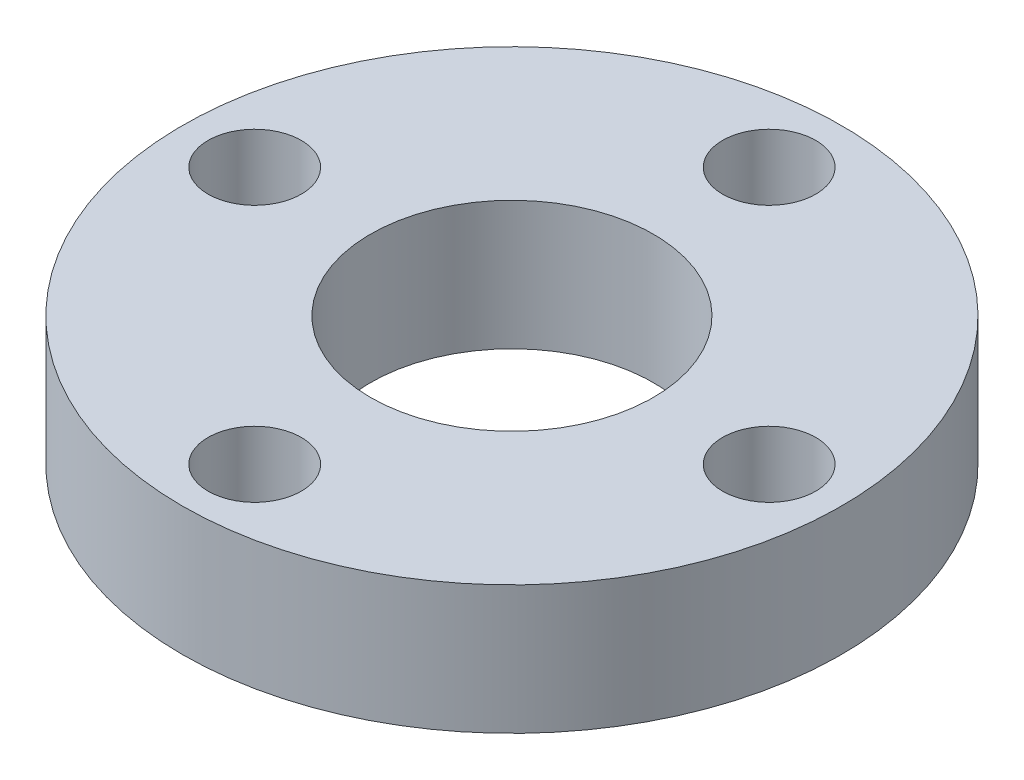
ISO-10303-21;
HEADER;
FILE_DESCRIPTION(('STEP AP214'),'2;1');
FILE_NAME('part.step','',(''),(''),'','','');
FILE_SCHEMA(('AUTOMOTIVE_DESIGN { 1 0 10303 214 1 1 1 1 }'));
ENDSEC;
DATA;
#1=APPLICATION_CONTEXT('core data for automotive mechanical design processes');
#2=APPLICATION_PROTOCOL_DEFINITION('international standard','automotive_design',2000,#1);
#3=PRODUCT_CONTEXT('',#1,'mechanical');
#4=PRODUCT('Part','Part','',(#3));
#5=PRODUCT_RELATED_PRODUCT_CATEGORY('part','',(#4));
#6=PRODUCT_DEFINITION_FORMATION('','',#4);
#7=PRODUCT_DEFINITION_CONTEXT('part definition',#1,'design');
#8=PRODUCT_DEFINITION('design','',#6,#7);
#9=PRODUCT_DEFINITION_SHAPE('','',#8);
#10=(LENGTH_UNIT() NAMED_UNIT(*) SI_UNIT(.MILLI.,.METRE.));
#11=(NAMED_UNIT(*) PLANE_ANGLE_UNIT() SI_UNIT($,.RADIAN.));
#12=(NAMED_UNIT(*) SI_UNIT($,.STERADIAN.) SOLID_ANGLE_UNIT());
#13=UNCERTAINTY_MEASURE_WITH_UNIT(LENGTH_MEASURE(1.E-05),#10,'distance_accuracy_value','');
#14=(GEOMETRIC_REPRESENTATION_CONTEXT(3) GLOBAL_UNCERTAINTY_ASSIGNED_CONTEXT((#13)) GLOBAL_UNIT_ASSIGNED_CONTEXT((#10,
#11,#12)) REPRESENTATION_CONTEXT('',''));
#15=CARTESIAN_POINT('',(0.,0.,0.));
#16=DIRECTION('',(0.,0.,1.));
#17=DIRECTION('',(1.,0.,0.));
#18=AXIS2_PLACEMENT_3D('',#15,#16,#17);
#19=CARTESIAN_POINT('',(0.,4.,0.));
#20=DIRECTION('',(0.,-1.,0.));
#21=DIRECTION('',(0.,0.,-1.));
#22=AXIS2_PLACEMENT_3D('',#19,#20,#21);
#23=CYLINDRICAL_SURFACE('',#22,10.25);
#24=CARTESIAN_POINT('',(0.,4.,0.));
#25=DIRECTION('',(0.,1.,0.));
#26=DIRECTION('',(0.,0.,1.));
#27=AXIS2_PLACEMENT_3D('',#24,#25,#26);
#28=CIRCLE('',#27,10.25);
#29=CARTESIAN_POINT('',(0.,4.,10.25));
#30=VERTEX_POINT('',#29);
#31=EDGE_CURVE('E54',#30,#30,#28,.T.);
#32=ORIENTED_EDGE('',*,*,#31,.F.);
#33=EDGE_LOOP('',(#32));
#34=FACE_BOUND('',#33,.T.);
#35=CARTESIAN_POINT('',(0.,0.,0.));
#36=DIRECTION('',(0.,1.,0.));
#37=DIRECTION('',(0.,0.,1.));
#38=AXIS2_PLACEMENT_3D('',#35,#36,#37);
#39=CIRCLE('',#38,10.25);
#40=CARTESIAN_POINT('',(0.,0.,10.25));
#41=VERTEX_POINT('',#40);
#42=EDGE_CURVE('E79',#41,#41,#39,.T.);
#43=ORIENTED_EDGE('',*,*,#42,.T.);
#44=EDGE_LOOP('',(#43));
#45=FACE_BOUND('',#44,.T.);
#46=ADVANCED_FACE('F45',(#34,#45),#23,.T.);
#47=CARTESIAN_POINT('',(0.,4.,8.));
#48=DIRECTION('',(0.,-1.,0.));
#49=DIRECTION('',(0.,0.,-1.));
#50=AXIS2_PLACEMENT_3D('',#47,#48,#49);
#51=CYLINDRICAL_SURFACE('',#50,1.45);
#52=CARTESIAN_POINT('',(0.,4.,8.));
#53=DIRECTION('',(0.,1.,0.));
#54=DIRECTION('',(0.,0.,1.));
#55=AXIS2_PLACEMENT_3D('',#52,#53,#54);
#56=CIRCLE('',#55,1.45);
#57=CARTESIAN_POINT('',(0.,4.,9.45));
#58=VERTEX_POINT('',#57);
#59=EDGE_CURVE('E60',#58,#58,#56,.T.);
#60=ORIENTED_EDGE('',*,*,#59,.T.);
#61=EDGE_LOOP('',(#60));
#62=FACE_BOUND('',#61,.T.);
#63=CARTESIAN_POINT('',(0.,0.,8.));
#64=DIRECTION('',(0.,1.,0.));
#65=DIRECTION('',(0.,0.,1.));
#66=AXIS2_PLACEMENT_3D('',#63,#64,#65);
#67=CIRCLE('',#66,1.45);
#68=CARTESIAN_POINT('',(0.,0.,9.45));
#69=VERTEX_POINT('',#68);
#70=EDGE_CURVE('E76',#69,#69,#67,.T.);
#71=ORIENTED_EDGE('',*,*,#70,.F.);
#72=EDGE_LOOP('',(#71));
#73=FACE_BOUND('',#72,.T.);
#74=ADVANCED_FACE('F106',(#62,#73),#51,.F.);
#75=CARTESIAN_POINT('',(8.,4.,0.));
#76=DIRECTION('',(0.,-1.,0.));
#77=DIRECTION('',(0.,0.,-1.));
#78=AXIS2_PLACEMENT_3D('',#75,#76,#77);
#79=CYLINDRICAL_SURFACE('',#78,1.45);
#80=CARTESIAN_POINT('',(8.,4.,0.));
#81=DIRECTION('',(0.,1.,0.));
#82=DIRECTION('',(0.,0.,1.));
#83=AXIS2_PLACEMENT_3D('',#80,#81,#82);
#84=CIRCLE('',#83,1.45);
#85=CARTESIAN_POINT('',(8.,4.,1.45000000000003));
#86=VERTEX_POINT('',#85);
#87=EDGE_CURVE('E97',#86,#86,#84,.T.);
#88=ORIENTED_EDGE('',*,*,#87,.T.);
#89=EDGE_LOOP('',(#88));
#90=FACE_BOUND('',#89,.T.);
#91=CARTESIAN_POINT('',(8.,0.,0.));
#92=DIRECTION('',(0.,1.,0.));
#93=DIRECTION('',(0.,0.,1.));
#94=AXIS2_PLACEMENT_3D('',#91,#92,#93);
#95=CIRCLE('',#94,1.45);
#96=CARTESIAN_POINT('',(8.,0.,1.45000000000003));
#97=VERTEX_POINT('',#96);
#98=EDGE_CURVE('E72',#97,#97,#95,.T.);
#99=ORIENTED_EDGE('',*,*,#98,.F.);
#100=EDGE_LOOP('',(#99));
#101=FACE_BOUND('',#100,.T.);
#102=ADVANCED_FACE('F124',(#90,#101),#79,.F.);
#103=CARTESIAN_POINT('',(0.,4.,-8.));
#104=DIRECTION('',(0.,-1.,0.));
#105=DIRECTION('',(0.,0.,-1.));
#106=AXIS2_PLACEMENT_3D('',#103,#104,#105);
#107=CYLINDRICAL_SURFACE('',#106,1.45);
#108=CARTESIAN_POINT('',(0.,4.,-8.));
#109=DIRECTION('',(0.,1.,0.));
#110=DIRECTION('',(0.,0.,1.));
#111=AXIS2_PLACEMENT_3D('',#108,#109,#110);
#112=CIRCLE('',#111,1.45);
#113=CARTESIAN_POINT('',(0.,4.,-6.55));
#114=VERTEX_POINT('',#113);
#115=EDGE_CURVE('E91',#114,#114,#112,.T.);
#116=ORIENTED_EDGE('',*,*,#115,.T.);
#117=EDGE_LOOP('',(#116));
#118=FACE_BOUND('',#117,.T.);
#119=CARTESIAN_POINT('',(0.,0.,-8.));
#120=DIRECTION('',(0.,1.,0.));
#121=DIRECTION('',(0.,0.,1.));
#122=AXIS2_PLACEMENT_3D('',#119,#120,#121);
#123=CIRCLE('',#122,1.45);
#124=CARTESIAN_POINT('',(0.,0.,-6.55));
#125=VERTEX_POINT('',#124);
#126=EDGE_CURVE('E68',#125,#125,#123,.T.);
#127=ORIENTED_EDGE('',*,*,#126,.F.);
#128=EDGE_LOOP('',(#127));
#129=FACE_BOUND('',#128,.T.);
#130=ADVANCED_FACE('F130',(#118,#129),#107,.F.);
#131=CARTESIAN_POINT('',(-8.,4.,0.));
#132=DIRECTION('',(0.,-1.,0.));
#133=DIRECTION('',(0.,0.,-1.));
#134=AXIS2_PLACEMENT_3D('',#131,#132,#133);
#135=CYLINDRICAL_SURFACE('',#134,1.45);
#136=CARTESIAN_POINT('',(-8.,4.,0.));
#137=DIRECTION('',(0.,1.,0.));
#138=DIRECTION('',(0.,0.,1.));
#139=AXIS2_PLACEMENT_3D('',#136,#137,#138);
#140=CIRCLE('',#139,1.45);
#141=CARTESIAN_POINT('',(-8.,4.,1.44999999999992));
#142=VERTEX_POINT('',#141);
#143=EDGE_CURVE('E86',#142,#142,#140,.T.);
#144=ORIENTED_EDGE('',*,*,#143,.T.);
#145=EDGE_LOOP('',(#144));
#146=FACE_BOUND('',#145,.T.);
#147=CARTESIAN_POINT('',(-8.,0.,0.));
#148=DIRECTION('',(0.,1.,0.));
#149=DIRECTION('',(0.,0.,1.));
#150=AXIS2_PLACEMENT_3D('',#147,#148,#149);
#151=CIRCLE('',#150,1.45);
#152=CARTESIAN_POINT('',(-8.,0.,1.44999999999992));
#153=VERTEX_POINT('',#152);
#154=EDGE_CURVE('E64',#153,#153,#151,.T.);
#155=ORIENTED_EDGE('',*,*,#154,.F.);
#156=EDGE_LOOP('',(#155));
#157=FACE_BOUND('',#156,.T.);
#158=ADVANCED_FACE('F47',(#146,#157),#135,.F.);
#159=CARTESIAN_POINT('',(0.,4.,0.));
#160=DIRECTION('',(0.,-1.,0.));
#161=DIRECTION('',(0.,0.,-1.));
#162=AXIS2_PLACEMENT_3D('',#159,#160,#161);
#163=CYLINDRICAL_SURFACE('',#162,4.4);
#164=CARTESIAN_POINT('',(0.,4.,0.));
#165=DIRECTION('',(0.,1.,0.));
#166=DIRECTION('',(0.,0.,1.));
#167=AXIS2_PLACEMENT_3D('',#164,#165,#166);
#168=CIRCLE('',#167,4.4);
#169=CARTESIAN_POINT('',(0.,4.,4.4));
#170=VERTEX_POINT('',#169);
#171=EDGE_CURVE('E10',#170,#170,#168,.T.);
#172=ORIENTED_EDGE('',*,*,#171,.T.);
#173=EDGE_LOOP('',(#172));
#174=FACE_BOUND('',#173,.T.);
#175=CARTESIAN_POINT('',(0.,0.,0.));
#176=DIRECTION('',(0.,1.,0.));
#177=DIRECTION('',(0.,0.,1.));
#178=AXIS2_PLACEMENT_3D('',#175,#176,#177);
#179=CIRCLE('',#178,4.4);
#180=CARTESIAN_POINT('',(0.,0.,4.4));
#181=VERTEX_POINT('',#180);
#182=EDGE_CURVE('E49',#181,#181,#179,.T.);
#183=ORIENTED_EDGE('',*,*,#182,.F.);
#184=EDGE_LOOP('',(#183));
#185=FACE_BOUND('',#184,.T.);
#186=ADVANCED_FACE('F113',(#174,#185),#163,.F.);
#187=CARTESIAN_POINT('',(0.,4.,0.));
#188=DIRECTION('',(0.,1.,0.));
#189=DIRECTION('',(0.,0.,1.));
#190=AXIS2_PLACEMENT_3D('',#187,#188,#189);
#191=PLANE('',#190);
#192=ORIENTED_EDGE('',*,*,#143,.F.);
#193=EDGE_LOOP('',(#192));
#194=FACE_BOUND('',#193,.T.);
#195=ORIENTED_EDGE('',*,*,#115,.F.);
#196=EDGE_LOOP('',(#195));
#197=FACE_BOUND('',#196,.T.);
#198=ORIENTED_EDGE('',*,*,#87,.F.);
#199=EDGE_LOOP('',(#198));
#200=FACE_BOUND('',#199,.T.);
#201=ORIENTED_EDGE('',*,*,#59,.F.);
#202=EDGE_LOOP('',(#201));
#203=FACE_BOUND('',#202,.T.);
#204=ORIENTED_EDGE('',*,*,#31,.T.);
#205=EDGE_LOOP('',(#204));
#206=FACE_BOUND('',#205,.T.);
#207=ORIENTED_EDGE('',*,*,#171,.F.);
#208=EDGE_LOOP('',(#207));
#209=FACE_BOUND('',#208,.T.);
#210=ADVANCED_FACE('F109',(#194,#197,#200,#203,#206,#209),#191,.T.);
#211=CARTESIAN_POINT('',(0.,0.,0.));
#212=DIRECTION('',(0.,1.,0.));
#213=DIRECTION('',(0.,0.,1.));
#214=AXIS2_PLACEMENT_3D('',#211,#212,#213);
#215=PLANE('',#214);
#216=ORIENTED_EDGE('',*,*,#154,.T.);
#217=EDGE_LOOP('',(#216));
#218=FACE_BOUND('',#217,.T.);
#219=ORIENTED_EDGE('',*,*,#126,.T.);
#220=EDGE_LOOP('',(#219));
#221=FACE_BOUND('',#220,.T.);
#222=ORIENTED_EDGE('',*,*,#98,.T.);
#223=EDGE_LOOP('',(#222));
#224=FACE_BOUND('',#223,.T.);
#225=ORIENTED_EDGE('',*,*,#70,.T.);
#226=EDGE_LOOP('',(#225));
#227=FACE_BOUND('',#226,.T.);
#228=ORIENTED_EDGE('',*,*,#42,.F.);
#229=EDGE_LOOP('',(#228));
#230=FACE_BOUND('',#229,.T.);
#231=ORIENTED_EDGE('',*,*,#182,.T.);
#232=EDGE_LOOP('',(#231));
#233=FACE_BOUND('',#232,.T.);
#234=ADVANCED_FACE('F112',(#218,#221,#224,#227,#230,#233),#215,.F.);
#235=CLOSED_SHELL('',(#46,#74,#102,#130,#158,#186,#210,#234));
#236=MANIFOLD_SOLID_BREP('B2',#235);
#237=ADVANCED_BREP_SHAPE_REPRESENTATION('',(#18,#236),#14);
#238=SHAPE_DEFINITION_REPRESENTATION(#9,#237);
ENDSEC;
END-ISO-10303-21;
